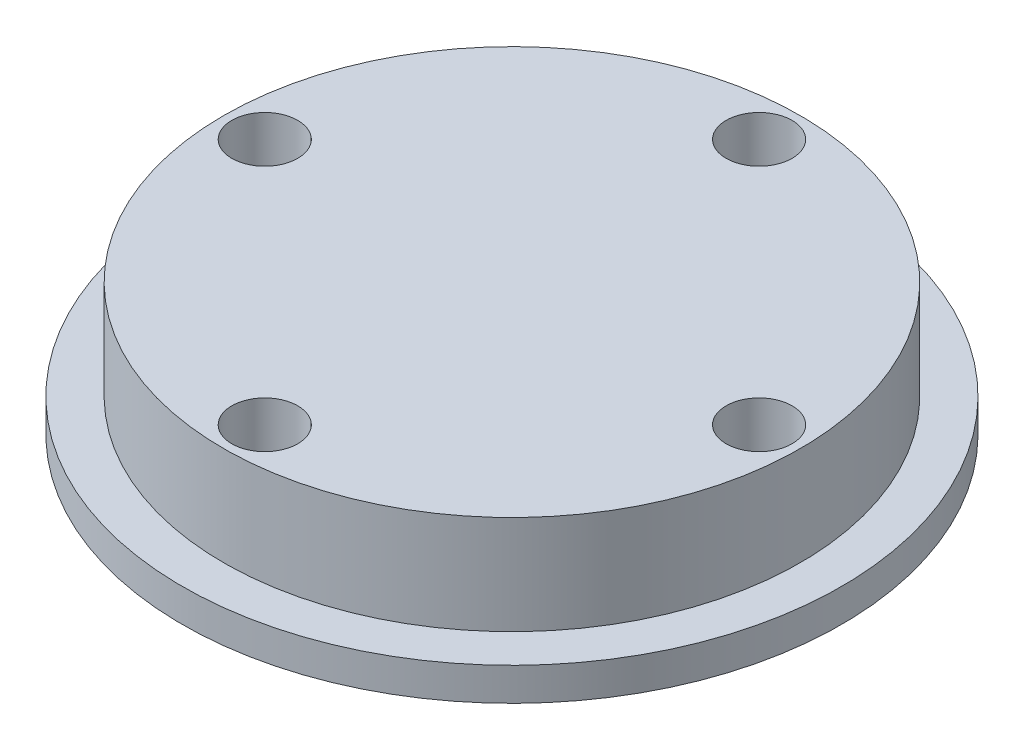
ISO-10303-21;
HEADER;
FILE_DESCRIPTION(('STEP AP214'),'2;1');
FILE_NAME('part.step','',(''),(''),'','','');
FILE_SCHEMA(('AUTOMOTIVE_DESIGN { 1 0 10303 214 1 1 1 1 }'));
ENDSEC;
DATA;
#1=APPLICATION_CONTEXT('core data for automotive mechanical design processes');
#2=APPLICATION_PROTOCOL_DEFINITION('international standard','automotive_design',2000,#1);
#3=PRODUCT_CONTEXT('',#1,'mechanical');
#4=PRODUCT('Part','Part','',(#3));
#5=PRODUCT_RELATED_PRODUCT_CATEGORY('part','',(#4));
#6=PRODUCT_DEFINITION_FORMATION('','',#4);
#7=PRODUCT_DEFINITION_CONTEXT('part definition',#1,'design');
#8=PRODUCT_DEFINITION('design','',#6,#7);
#9=PRODUCT_DEFINITION_SHAPE('','',#8);
#10=(LENGTH_UNIT() NAMED_UNIT(*) SI_UNIT(.MILLI.,.METRE.));
#11=(NAMED_UNIT(*) PLANE_ANGLE_UNIT() SI_UNIT($,.RADIAN.));
#12=(NAMED_UNIT(*) SI_UNIT($,.STERADIAN.) SOLID_ANGLE_UNIT());
#13=UNCERTAINTY_MEASURE_WITH_UNIT(LENGTH_MEASURE(1.E-05),#10,'distance_accuracy_value','');
#14=(GEOMETRIC_REPRESENTATION_CONTEXT(3) GLOBAL_UNCERTAINTY_ASSIGNED_CONTEXT((#13)) GLOBAL_UNIT_ASSIGNED_CONTEXT((#10,
#11,#12)) REPRESENTATION_CONTEXT('',''));
#15=CARTESIAN_POINT('',(0.,0.,0.));
#16=DIRECTION('',(0.,0.,1.));
#17=DIRECTION('',(1.,0.,0.));
#18=AXIS2_PLACEMENT_3D('',#15,#16,#17);
#19=CARTESIAN_POINT('',(0.,0.,0.));
#20=DIRECTION('',(0.,-1.,0.));
#21=DIRECTION('',(1.,0.,0.));
#22=AXIS2_PLACEMENT_3D('',#19,#20,#21);
#23=PLANE('',#22);
#24=CARTESIAN_POINT('',(0.,0.,-15.));
#25=DIRECTION('',(0.,-1.,0.));
#26=DIRECTION('',(1.,0.,0.));
#27=AXIS2_PLACEMENT_3D('',#24,#25,#26);
#28=CIRCLE('',#27,2.);
#29=CARTESIAN_POINT('',(2.,0.,-15.));
#30=VERTEX_POINT('',#29);
#31=EDGE_CURVE('E50',#30,#30,#28,.F.);
#32=ORIENTED_EDGE('',*,*,#31,.T.);
#33=EDGE_LOOP('',(#32));
#34=FACE_BOUND('',#33,.T.);
#35=CARTESIAN_POINT('',(15.0000000000004,0.,-4.24488671257339E-13));
#36=DIRECTION('',(0.,-1.,0.));
#37=DIRECTION('',(1.,0.,0.));
#38=AXIS2_PLACEMENT_3D('',#35,#36,#37);
#39=CIRCLE('',#38,2.00000000000033);
#40=CARTESIAN_POINT('',(17.0000000000008,0.,-4.24488671257339E-13));
#41=VERTEX_POINT('',#40);
#42=EDGE_CURVE('E72',#41,#41,#39,.F.);
#43=ORIENTED_EDGE('',*,*,#42,.T.);
#44=EDGE_LOOP('',(#43));
#45=FACE_BOUND('',#44,.T.);
#46=CARTESIAN_POINT('',(8.48977342514678E-13,0.,15.));
#47=DIRECTION('',(0.,-1.,0.));
#48=DIRECTION('',(1.,0.,0.));
#49=AXIS2_PLACEMENT_3D('',#46,#47,#48);
#50=CIRCLE('',#49,2.00000000000091);
#51=CARTESIAN_POINT('',(2.00000000000176,0.,15.));
#52=VERTEX_POINT('',#51);
#53=EDGE_CURVE('E69',#52,#52,#50,.F.);
#54=ORIENTED_EDGE('',*,*,#53,.T.);
#55=EDGE_LOOP('',(#54));
#56=FACE_BOUND('',#55,.T.);
#57=CARTESIAN_POINT('',(-14.9999999999996,0.,4.2632564145606E-13));
#58=DIRECTION('',(0.,-1.,0.));
#59=DIRECTION('',(1.,0.,0.));
#60=AXIS2_PLACEMENT_3D('',#57,#58,#59);
#61=CIRCLE('',#60,2.00000000000068);
#62=CARTESIAN_POINT('',(-12.9999999999989,0.,4.2632564145606E-13));
#63=VERTEX_POINT('',#62);
#64=EDGE_CURVE('E66',#63,#63,#61,.F.);
#65=ORIENTED_EDGE('',*,*,#64,.T.);
#66=EDGE_LOOP('',(#65));
#67=FACE_BOUND('',#66,.T.);
#68=CARTESIAN_POINT('',(0.,0.,0.));
#69=DIRECTION('',(0.,1.,0.));
#70=DIRECTION('',(-1.,0.,0.));
#71=AXIS2_PLACEMENT_3D('',#68,#69,#70);
#72=CIRCLE('',#71,20.);
#73=CARTESIAN_POINT('',(-20.,0.,0.));
#74=VERTEX_POINT('',#73);
#75=EDGE_CURVE('E10',#74,#74,#72,.T.);
#76=ORIENTED_EDGE('',*,*,#75,.F.);
#77=EDGE_LOOP('',(#76));
#78=FACE_BOUND('',#77,.T.);
#79=ADVANCED_FACE('F30',(#34,#45,#56,#67,#78),#23,.T.);
#80=CARTESIAN_POINT('',(0.,8.,0.));
#81=DIRECTION('',(0.,1.,0.));
#82=DIRECTION('',(-1.,0.,0.));
#83=AXIS2_PLACEMENT_3D('',#80,#81,#82);
#84=CYLINDRICAL_SURFACE('',#83,20.);
#85=ORIENTED_EDGE('',*,*,#75,.T.);
#86=EDGE_LOOP('',(#85));
#87=FACE_BOUND('',#86,.T.);
#88=CARTESIAN_POINT('',(0.,1.99999999999999,0.));
#89=DIRECTION('',(0.,1.,0.));
#90=DIRECTION('',(-1.,0.,0.));
#91=AXIS2_PLACEMENT_3D('',#88,#89,#90);
#92=CIRCLE('',#91,20.);
#93=CARTESIAN_POINT('',(-20.,2.,0.));
#94=VERTEX_POINT('',#93);
#95=EDGE_CURVE('E37',#94,#94,#92,.T.);
#96=ORIENTED_EDGE('',*,*,#95,.F.);
#97=EDGE_LOOP('',(#96));
#98=FACE_BOUND('',#97,.T.);
#99=ADVANCED_FACE('F92',(#87,#98),#84,.T.);
#100=CARTESIAN_POINT('',(-20.,2.,0.));
#101=DIRECTION('',(0.,1.,0.));
#102=DIRECTION('',(-1.,0.,0.));
#103=AXIS2_PLACEMENT_3D('',#100,#101,#102);
#104=PLANE('',#103);
#105=ORIENTED_EDGE('',*,*,#95,.T.);
#106=EDGE_LOOP('',(#105));
#107=FACE_BOUND('',#106,.T.);
#108=CARTESIAN_POINT('',(0.,1.99999999999999,0.));
#109=DIRECTION('',(0.,1.,0.));
#110=DIRECTION('',(-1.,0.,0.));
#111=AXIS2_PLACEMENT_3D('',#108,#109,#110);
#112=CIRCLE('',#111,17.5);
#113=CARTESIAN_POINT('',(-17.5,2.,0.));
#114=VERTEX_POINT('',#113);
#115=EDGE_CURVE('E42',#114,#114,#112,.T.);
#116=ORIENTED_EDGE('',*,*,#115,.F.);
#117=EDGE_LOOP('',(#116));
#118=FACE_BOUND('',#117,.T.);
#119=ADVANCED_FACE('F96',(#107,#118),#104,.T.);
#120=CARTESIAN_POINT('',(0.,8.,0.));
#121=DIRECTION('',(0.,1.,0.));
#122=DIRECTION('',(-1.,0.,0.));
#123=AXIS2_PLACEMENT_3D('',#120,#121,#122);
#124=CYLINDRICAL_SURFACE('',#123,17.5);
#125=ORIENTED_EDGE('',*,*,#115,.T.);
#126=EDGE_LOOP('',(#125));
#127=FACE_BOUND('',#126,.T.);
#128=CARTESIAN_POINT('',(0.,7.99999999999999,0.));
#129=DIRECTION('',(0.,1.,0.));
#130=DIRECTION('',(-1.,0.,0.));
#131=AXIS2_PLACEMENT_3D('',#128,#129,#130);
#132=CIRCLE('',#131,17.5);
#133=CARTESIAN_POINT('',(-17.5,8.,0.));
#134=VERTEX_POINT('',#133);
#135=EDGE_CURVE('E57',#134,#134,#132,.T.);
#136=ORIENTED_EDGE('',*,*,#135,.F.);
#137=EDGE_LOOP('',(#136));
#138=FACE_BOUND('',#137,.T.);
#139=ADVANCED_FACE('F100',(#127,#138),#124,.T.);
#140=CARTESIAN_POINT('',(-17.5,8.,0.));
#141=DIRECTION('',(0.,1.,0.));
#142=DIRECTION('',(-1.,0.,0.));
#143=AXIS2_PLACEMENT_3D('',#140,#141,#142);
#144=PLANE('',#143);
#145=CARTESIAN_POINT('',(0.,7.99999999999999,-15.));
#146=DIRECTION('',(0.,1.,0.));
#147=DIRECTION('',(-1.,0.,0.));
#148=AXIS2_PLACEMENT_3D('',#145,#146,#147);
#149=CIRCLE('',#148,2.);
#150=CARTESIAN_POINT('',(2.,7.99999999999999,-15.));
#151=VERTEX_POINT('',#150);
#152=EDGE_CURVE('E33',#151,#151,#149,.F.);
#153=ORIENTED_EDGE('',*,*,#152,.T.);
#154=EDGE_LOOP('',(#153));
#155=FACE_BOUND('',#154,.T.);
#156=CARTESIAN_POINT('',(15.0000000000004,7.99999999999999,-4.24488671257339E-13));
#157=DIRECTION('',(0.,1.,0.));
#158=DIRECTION('',(-1.,0.,0.));
#159=AXIS2_PLACEMENT_3D('',#156,#157,#158);
#160=CIRCLE('',#159,2.00000000000033);
#161=CARTESIAN_POINT('',(17.0000000000008,7.99999999999999,-4.24488671257339E-13));
#162=VERTEX_POINT('',#161);
#163=EDGE_CURVE('E52',#162,#162,#160,.F.);
#164=ORIENTED_EDGE('',*,*,#163,.T.);
#165=EDGE_LOOP('',(#164));
#166=FACE_BOUND('',#165,.T.);
#167=CARTESIAN_POINT('',(8.51333124420579E-13,7.99999999999999,15.));
#168=DIRECTION('',(0.,1.,0.));
#169=DIRECTION('',(-1.,0.,0.));
#170=AXIS2_PLACEMENT_3D('',#167,#168,#169);
#171=CIRCLE('',#170,2.00000000000091);
#172=CARTESIAN_POINT('',(2.00000000000176,7.99999999999999,15.));
#173=VERTEX_POINT('',#172);
#174=EDGE_CURVE('E49',#173,#173,#171,.F.);
#175=ORIENTED_EDGE('',*,*,#174,.T.);
#176=EDGE_LOOP('',(#175));
#177=FACE_BOUND('',#176,.T.);
#178=CARTESIAN_POINT('',(-14.9999999999996,8.,4.2632564145606E-13));
#179=DIRECTION('',(0.,1.,0.));
#180=DIRECTION('',(-1.,0.,0.));
#181=AXIS2_PLACEMENT_3D('',#178,#179,#180);
#182=CIRCLE('',#181,2.00000000000068);
#183=CARTESIAN_POINT('',(-12.9999999999989,8.,4.2632564145606E-13));
#184=VERTEX_POINT('',#183);
#185=EDGE_CURVE('E46',#184,#184,#182,.F.);
#186=ORIENTED_EDGE('',*,*,#185,.T.);
#187=EDGE_LOOP('',(#186));
#188=FACE_BOUND('',#187,.T.);
#189=ORIENTED_EDGE('',*,*,#135,.T.);
#190=EDGE_LOOP('',(#189));
#191=FACE_BOUND('',#190,.T.);
#192=ADVANCED_FACE('F107',(#155,#166,#177,#188,#191),#144,.T.);
#193=CARTESIAN_POINT('',(-14.9999999999996,8.000012,4.2632564145606E-13));
#194=DIRECTION('',(0.,-1.,0.));
#195=DIRECTION('',(1.,0.,0.));
#196=AXIS2_PLACEMENT_3D('',#193,#194,#195);
#197=CYLINDRICAL_SURFACE('',#196,2.00000000000068);
#198=CARTESIAN_POINT('',(-12.9999999999989,8.,4.2632564145606E-13));
#199=CARTESIAN_POINT('',(-12.9999999999989,7.91666666666667,4.2632564145606E-13));
#200=CARTESIAN_POINT('',(-12.9999999999989,7.83333333333333,4.2632564145606E-13));
#201=CARTESIAN_POINT('',(-12.9999999999989,7.66666666666667,4.2632564145606E-13));
#202=CARTESIAN_POINT('',(-12.9999999999989,7.58333333333333,4.2632564145606E-13));
#203=CARTESIAN_POINT('',(-12.9999999999989,7.41666666666667,4.2632564145606E-13));
#204=CARTESIAN_POINT('',(-12.9999999999989,7.33333333333333,4.2632564145606E-13));
#205=CARTESIAN_POINT('',(-12.9999999999989,7.16666666666667,4.2632564145606E-13));
#206=CARTESIAN_POINT('',(-12.9999999999989,7.08333333333333,4.2632564145606E-13));
#207=CARTESIAN_POINT('',(-12.9999999999989,6.91666666666667,4.2632564145606E-13));
#208=CARTESIAN_POINT('',(-12.9999999999989,6.83333333333333,4.2632564145606E-13));
#209=CARTESIAN_POINT('',(-12.9999999999989,6.66666666666667,4.2632564145606E-13));
#210=CARTESIAN_POINT('',(-12.9999999999989,6.58333333333333,4.2632564145606E-13));
#211=CARTESIAN_POINT('',(-12.9999999999989,6.41666666666667,4.2632564145606E-13));
#212=CARTESIAN_POINT('',(-12.9999999999989,6.33333333333333,4.2632564145606E-13));
#213=CARTESIAN_POINT('',(-12.9999999999989,6.16666666666667,4.2632564145606E-13));
#214=CARTESIAN_POINT('',(-12.9999999999989,6.08333333333333,4.2632564145606E-13));
#215=CARTESIAN_POINT('',(-12.9999999999989,5.91666666666667,4.2632564145606E-13));
#216=CARTESIAN_POINT('',(-12.9999999999989,5.83333333333333,4.2632564145606E-13));
#217=CARTESIAN_POINT('',(-12.9999999999989,5.66666666666667,4.2632564145606E-13));
#218=CARTESIAN_POINT('',(-12.9999999999989,5.58333333333333,4.2632564145606E-13));
#219=CARTESIAN_POINT('',(-12.9999999999989,5.41666666666667,4.2632564145606E-13));
#220=CARTESIAN_POINT('',(-12.9999999999989,5.33333333333333,4.2632564145606E-13));
#221=CARTESIAN_POINT('',(-12.9999999999989,5.16666666666667,4.2632564145606E-13));
#222=CARTESIAN_POINT('',(-12.9999999999989,5.08333333333333,4.2632564145606E-13));
#223=CARTESIAN_POINT('',(-12.9999999999989,4.91666666666667,4.2632564145606E-13));
#224=CARTESIAN_POINT('',(-12.9999999999989,4.83333333333333,4.2632564145606E-13));
#225=CARTESIAN_POINT('',(-12.9999999999989,4.66666666666667,4.2632564145606E-13));
#226=CARTESIAN_POINT('',(-12.9999999999989,4.58333333333333,4.2632564145606E-13));
#227=CARTESIAN_POINT('',(-12.9999999999989,4.41666666666667,4.2632564145606E-13));
#228=CARTESIAN_POINT('',(-12.9999999999989,4.33333333333333,4.2632564145606E-13));
#229=CARTESIAN_POINT('',(-12.9999999999989,4.16666666666667,4.2632564145606E-13));
#230=CARTESIAN_POINT('',(-12.9999999999989,4.08333333333333,4.2632564145606E-13));
#231=CARTESIAN_POINT('',(-12.9999999999989,3.91666666666667,4.2632564145606E-13));
#232=CARTESIAN_POINT('',(-12.9999999999989,3.83333333333333,4.2632564145606E-13));
#233=CARTESIAN_POINT('',(-12.9999999999989,3.66666666666667,4.2632564145606E-13));
#234=CARTESIAN_POINT('',(-12.9999999999989,3.58333333333333,4.2632564145606E-13));
#235=CARTESIAN_POINT('',(-12.9999999999989,3.41666666666667,4.2632564145606E-13));
#236=CARTESIAN_POINT('',(-12.9999999999989,3.33333333333333,4.2632564145606E-13));
#237=CARTESIAN_POINT('',(-12.9999999999989,3.16666666666667,4.2632564145606E-13));
#238=CARTESIAN_POINT('',(-12.9999999999989,3.08333333333333,4.2632564145606E-13));
#239=CARTESIAN_POINT('',(-12.9999999999989,2.91666666666667,4.2632564145606E-13));
#240=CARTESIAN_POINT('',(-12.9999999999989,2.83333333333333,4.2632564145606E-13));
#241=CARTESIAN_POINT('',(-12.9999999999989,2.66666666666667,4.2632564145606E-13));
#242=CARTESIAN_POINT('',(-12.9999999999989,2.58333333333333,4.2632564145606E-13));
#243=CARTESIAN_POINT('',(-12.9999999999989,2.41666666666667,4.2632564145606E-13));
#244=CARTESIAN_POINT('',(-12.9999999999989,2.33333333333333,4.2632564145606E-13));
#245=CARTESIAN_POINT('',(-12.9999999999989,2.16666666666667,4.2632564145606E-13));
#246=CARTESIAN_POINT('',(-12.9999999999989,2.08333333333334,4.2632564145606E-13));
#247=CARTESIAN_POINT('',(-12.9999999999989,1.91666666666667,4.2632564145606E-13));
#248=CARTESIAN_POINT('',(-12.9999999999989,1.83333333333334,4.2632564145606E-13));
#249=CARTESIAN_POINT('',(-12.9999999999989,1.66666666666667,4.2632564145606E-13));
#250=CARTESIAN_POINT('',(-12.9999999999989,1.58333333333333,4.2632564145606E-13));
#251=CARTESIAN_POINT('',(-12.9999999999989,1.41666666666667,4.2632564145606E-13));
#252=CARTESIAN_POINT('',(-12.9999999999989,1.33333333333333,4.2632564145606E-13));
#253=CARTESIAN_POINT('',(-12.9999999999989,1.16666666666667,4.2632564145606E-13));
#254=CARTESIAN_POINT('',(-12.9999999999989,1.08333333333333,4.2632564145606E-13));
#255=CARTESIAN_POINT('',(-12.9999999999989,0.916666666666668,4.2632564145606E-13));
#256=CARTESIAN_POINT('',(-12.9999999999989,0.833333333333335,4.2632564145606E-13));
#257=CARTESIAN_POINT('',(-12.9999999999989,0.666666666666668,4.2632564145606E-13));
#258=CARTESIAN_POINT('',(-12.9999999999989,0.583333333333335,4.2632564145606E-13));
#259=CARTESIAN_POINT('',(-12.9999999999989,0.416666666666668,4.2632564145606E-13));
#260=CARTESIAN_POINT('',(-12.9999999999989,0.333333333333335,4.2632564145606E-13));
#261=CARTESIAN_POINT('',(-12.9999999999989,0.166666666666669,4.2632564145606E-13));
#262=CARTESIAN_POINT('',(-12.9999999999989,0.0833333333333351,4.2632564145606E-13));
#263=CARTESIAN_POINT('',(-12.9999999999989,0.,4.2632564145606E-13));
#264=B_SPLINE_CURVE_WITH_KNOTS('',3,(#198,#199,#200,#201,#202,#203,#204,#205,#206,#207,#208,
#209,#210,#211,#212,#213,#214,#215,#216,#217,#218,#219,#220,#221,#222,#223,#224,#225,#226,#227,
#228,#229,#230,#231,#232,#233,#234,#235,#236,#237,#238,#239,#240,#241,#242,#243,#244,#245,#246,
#247,#248,#249,#250,#251,#252,#253,#254,#255,#256,#257,#258,#259,#260,#261,#262,#263),
.UNSPECIFIED.,.F.,.F.,(4,2,2,2,2,2,2,2,2,2,2,2,2,2,2,2,2,2,2,2,2,2,2,2,2,2,2,2,2,2,2,2,4),(0.,
0.249999999999999,0.499999999999999,0.749999999999999,0.999999999999999,1.25,1.5,1.75,2.,2.25,
2.5,2.75,3.,3.25,3.5,3.75,4.,4.25,4.5,4.75,5.,5.25,5.5,5.75,6.,6.25,6.5,6.75,7.,7.25,7.5,7.75,
8.),.UNSPECIFIED.);
#265=EDGE_CURVE('BSEAM111',#184,#63,#264,.T.);
#266=ORIENTED_EDGE('',*,*,#185,.F.);
#267=ORIENTED_EDGE('',*,*,#64,.F.);
#268=ORIENTED_EDGE('',*,*,#265,.T.);
#269=ORIENTED_EDGE('',*,*,#265,.F.);
#270=EDGE_LOOP('',(#266,#268,#267,#269));
#271=FACE_BOUND('',#270,.T.);
#272=ADVANCED_FACE('F111',(#271),#197,.F.);
#273=CARTESIAN_POINT('',(8.51333127954252E-13,8.000012,15.));
#274=DIRECTION('',(0.,-1.,0.));
#275=DIRECTION('',(1.,0.,0.));
#276=AXIS2_PLACEMENT_3D('',#273,#274,#275);
#277=CYLINDRICAL_SURFACE('',#276,2.00000000000091);
#278=CARTESIAN_POINT('',(2.00000000000176,7.99999999999999,15.));
#279=CARTESIAN_POINT('',(2.00000000000176,7.91666666666666,15.));
#280=CARTESIAN_POINT('',(2.00000000000176,7.83333333333333,15.));
#281=CARTESIAN_POINT('',(2.00000000000176,7.66666666666666,15.));
#282=CARTESIAN_POINT('',(2.00000000000176,7.58333333333333,15.));
#283=CARTESIAN_POINT('',(2.00000000000176,7.41666666666666,15.));
#284=CARTESIAN_POINT('',(2.00000000000176,7.33333333333333,15.));
#285=CARTESIAN_POINT('',(2.00000000000176,7.16666666666666,15.));
#286=CARTESIAN_POINT('',(2.00000000000176,7.08333333333333,15.));
#287=CARTESIAN_POINT('',(2.00000000000176,6.91666666666666,15.));
#288=CARTESIAN_POINT('',(2.00000000000176,6.83333333333333,15.));
#289=CARTESIAN_POINT('',(2.00000000000176,6.66666666666666,15.));
#290=CARTESIAN_POINT('',(2.00000000000176,6.58333333333333,15.));
#291=CARTESIAN_POINT('',(2.00000000000176,6.41666666666666,15.));
#292=CARTESIAN_POINT('',(2.00000000000176,6.33333333333333,15.));
#293=CARTESIAN_POINT('',(2.00000000000176,6.16666666666666,15.));
#294=CARTESIAN_POINT('',(2.00000000000176,6.08333333333333,15.));
#295=CARTESIAN_POINT('',(2.00000000000176,5.91666666666666,15.));
#296=CARTESIAN_POINT('',(2.00000000000176,5.83333333333333,15.));
#297=CARTESIAN_POINT('',(2.00000000000176,5.66666666666666,15.));
#298=CARTESIAN_POINT('',(2.00000000000176,5.58333333333333,15.));
#299=CARTESIAN_POINT('',(2.00000000000176,5.41666666666666,15.));
#300=CARTESIAN_POINT('',(2.00000000000176,5.33333333333333,15.));
#301=CARTESIAN_POINT('',(2.00000000000176,5.16666666666666,15.));
#302=CARTESIAN_POINT('',(2.00000000000176,5.08333333333333,15.));
#303=CARTESIAN_POINT('',(2.00000000000176,4.91666666666666,15.));
#304=CARTESIAN_POINT('',(2.00000000000176,4.83333333333333,15.));
#305=CARTESIAN_POINT('',(2.00000000000176,4.66666666666666,15.));
#306=CARTESIAN_POINT('',(2.00000000000176,4.58333333333333,15.));
#307=CARTESIAN_POINT('',(2.00000000000176,4.41666666666666,15.));
#308=CARTESIAN_POINT('',(2.00000000000176,4.33333333333333,15.));
#309=CARTESIAN_POINT('',(2.00000000000176,4.16666666666666,15.));
#310=CARTESIAN_POINT('',(2.00000000000176,4.08333333333333,15.));
#311=CARTESIAN_POINT('',(2.00000000000176,3.91666666666666,15.));
#312=CARTESIAN_POINT('',(2.00000000000176,3.83333333333333,15.));
#313=CARTESIAN_POINT('',(2.00000000000176,3.66666666666666,15.));
#314=CARTESIAN_POINT('',(2.00000000000176,3.58333333333333,15.));
#315=CARTESIAN_POINT('',(2.00000000000176,3.41666666666666,15.));
#316=CARTESIAN_POINT('',(2.00000000000176,3.33333333333333,15.));
#317=CARTESIAN_POINT('',(2.00000000000176,3.16666666666666,15.));
#318=CARTESIAN_POINT('',(2.00000000000176,3.08333333333333,15.));
#319=CARTESIAN_POINT('',(2.00000000000176,2.91666666666666,15.));
#320=CARTESIAN_POINT('',(2.00000000000176,2.83333333333333,15.));
#321=CARTESIAN_POINT('',(2.00000000000176,2.66666666666666,15.));
#322=CARTESIAN_POINT('',(2.00000000000176,2.58333333333333,15.));
#323=CARTESIAN_POINT('',(2.00000000000176,2.41666666666666,15.));
#324=CARTESIAN_POINT('',(2.00000000000176,2.33333333333333,15.));
#325=CARTESIAN_POINT('',(2.00000000000176,2.16666666666666,15.));
#326=CARTESIAN_POINT('',(2.00000000000176,2.08333333333333,15.));
#327=CARTESIAN_POINT('',(2.00000000000176,1.91666666666666,15.));
#328=CARTESIAN_POINT('',(2.00000000000176,1.83333333333333,15.));
#329=CARTESIAN_POINT('',(2.00000000000176,1.66666666666666,15.));
#330=CARTESIAN_POINT('',(2.00000000000176,1.58333333333333,15.));
#331=CARTESIAN_POINT('',(2.00000000000176,1.41666666666666,15.));
#332=CARTESIAN_POINT('',(2.00000000000176,1.33333333333333,15.));
#333=CARTESIAN_POINT('',(2.00000000000176,1.16666666666666,15.));
#334=CARTESIAN_POINT('',(2.00000000000176,1.08333333333333,15.));
#335=CARTESIAN_POINT('',(2.00000000000176,0.916666666666661,15.));
#336=CARTESIAN_POINT('',(2.00000000000176,0.833333333333328,15.));
#337=CARTESIAN_POINT('',(2.00000000000176,0.666666666666661,15.));
#338=CARTESIAN_POINT('',(2.00000000000176,0.583333333333328,15.));
#339=CARTESIAN_POINT('',(2.00000000000176,0.416666666666662,15.));
#340=CARTESIAN_POINT('',(2.00000000000176,0.333333333333328,15.));
#341=CARTESIAN_POINT('',(2.00000000000176,0.166666666666662,15.));
#342=CARTESIAN_POINT('',(2.00000000000176,0.0833333333333293,15.));
#343=CARTESIAN_POINT('',(2.00000000000176,0.,15.));
#344=B_SPLINE_CURVE_WITH_KNOTS('',3,(#278,#279,#280,#281,#282,#283,#284,#285,#286,#287,#288,
#289,#290,#291,#292,#293,#294,#295,#296,#297,#298,#299,#300,#301,#302,#303,#304,#305,#306,#307,
#308,#309,#310,#311,#312,#313,#314,#315,#316,#317,#318,#319,#320,#321,#322,#323,#324,#325,#326,
#327,#328,#329,#330,#331,#332,#333,#334,#335,#336,#337,#338,#339,#340,#341,#342,#343),
.UNSPECIFIED.,.F.,.F.,(4,2,2,2,2,2,2,2,2,2,2,2,2,2,2,2,2,2,2,2,2,2,2,2,2,2,2,2,2,2,2,2,4),(0.,
0.250000000000001,0.5,0.750000000000001,1.,1.25,1.5,1.75,2.,2.25,2.5,2.75,3.,3.25,3.5,3.75,4.,
4.25,4.5,4.75,5.,5.25,5.5,5.75,6.,6.25,6.5,6.75,7.,7.25,7.5,7.75,8.),.UNSPECIFIED.);
#345=EDGE_CURVE('BSEAM88',#173,#52,#344,.T.);
#346=ORIENTED_EDGE('',*,*,#174,.F.);
#347=ORIENTED_EDGE('',*,*,#53,.F.);
#348=ORIENTED_EDGE('',*,*,#345,.T.);
#349=ORIENTED_EDGE('',*,*,#345,.F.);
#350=EDGE_LOOP('',(#346,#348,#347,#349));
#351=FACE_BOUND('',#350,.T.);
#352=ADVANCED_FACE('F88',(#351),#277,.F.);
#353=CARTESIAN_POINT('',(15.0000000000004,8.00001199999999,-4.24488671257339E-13));
#354=DIRECTION('',(0.,-1.,0.));
#355=DIRECTION('',(1.,0.,0.));
#356=AXIS2_PLACEMENT_3D('',#353,#354,#355);
#357=CYLINDRICAL_SURFACE('',#356,2.00000000000033);
#358=CARTESIAN_POINT('',(17.0000000000008,7.99999999999999,-4.24488671257339E-13));
#359=CARTESIAN_POINT('',(17.0000000000008,7.91666666666666,-4.24488671257339E-13));
#360=CARTESIAN_POINT('',(17.0000000000008,7.83333333333332,-4.24488671257339E-13));
#361=CARTESIAN_POINT('',(17.0000000000008,7.66666666666666,-4.24488671257339E-13));
#362=CARTESIAN_POINT('',(17.0000000000008,7.58333333333332,-4.24488671257339E-13));
#363=CARTESIAN_POINT('',(17.0000000000008,7.41666666666666,-4.24488671257339E-13));
#364=CARTESIAN_POINT('',(17.0000000000008,7.33333333333332,-4.24488671257339E-13));
#365=CARTESIAN_POINT('',(17.0000000000008,7.16666666666666,-4.24488671257339E-13));
#366=CARTESIAN_POINT('',(17.0000000000008,7.08333333333332,-4.24488671257339E-13));
#367=CARTESIAN_POINT('',(17.0000000000008,6.91666666666666,-4.24488671257339E-13));
#368=CARTESIAN_POINT('',(17.0000000000008,6.83333333333332,-4.24488671257339E-13));
#369=CARTESIAN_POINT('',(17.0000000000008,6.66666666666666,-4.24488671257339E-13));
#370=CARTESIAN_POINT('',(17.0000000000008,6.58333333333332,-4.24488671257339E-13));
#371=CARTESIAN_POINT('',(17.0000000000008,6.41666666666666,-4.24488671257339E-13));
#372=CARTESIAN_POINT('',(17.0000000000008,6.33333333333332,-4.24488671257339E-13));
#373=CARTESIAN_POINT('',(17.0000000000008,6.16666666666666,-4.24488671257339E-13));
#374=CARTESIAN_POINT('',(17.0000000000008,6.08333333333332,-4.24488671257339E-13));
#375=CARTESIAN_POINT('',(17.0000000000008,5.91666666666666,-4.24488671257339E-13));
#376=CARTESIAN_POINT('',(17.0000000000008,5.83333333333332,-4.24488671257339E-13));
#377=CARTESIAN_POINT('',(17.0000000000008,5.66666666666666,-4.24488671257339E-13));
#378=CARTESIAN_POINT('',(17.0000000000008,5.58333333333332,-4.24488671257339E-13));
#379=CARTESIAN_POINT('',(17.0000000000008,5.41666666666666,-4.24488671257339E-13));
#380=CARTESIAN_POINT('',(17.0000000000008,5.33333333333332,-4.24488671257339E-13));
#381=CARTESIAN_POINT('',(17.0000000000008,5.16666666666666,-4.24488671257339E-13));
#382=CARTESIAN_POINT('',(17.0000000000008,5.08333333333332,-4.24488671257339E-13));
#383=CARTESIAN_POINT('',(17.0000000000008,4.91666666666666,-4.24488671257339E-13));
#384=CARTESIAN_POINT('',(17.0000000000008,4.83333333333332,-4.24488671257339E-13));
#385=CARTESIAN_POINT('',(17.0000000000008,4.66666666666666,-4.24488671257339E-13));
#386=CARTESIAN_POINT('',(17.0000000000008,4.58333333333332,-4.24488671257339E-13));
#387=CARTESIAN_POINT('',(17.0000000000008,4.41666666666666,-4.24488671257339E-13));
#388=CARTESIAN_POINT('',(17.0000000000008,4.33333333333332,-4.24488671257339E-13));
#389=CARTESIAN_POINT('',(17.0000000000008,4.16666666666666,-4.24488671257339E-13));
#390=CARTESIAN_POINT('',(17.0000000000008,4.08333333333332,-4.24488671257339E-13));
#391=CARTESIAN_POINT('',(17.0000000000008,3.91666666666666,-4.24488671257339E-13));
#392=CARTESIAN_POINT('',(17.0000000000008,3.83333333333332,-4.24488671257339E-13));
#393=CARTESIAN_POINT('',(17.0000000000008,3.66666666666666,-4.24488671257339E-13));
#394=CARTESIAN_POINT('',(17.0000000000008,3.58333333333332,-4.24488671257339E-13));
#395=CARTESIAN_POINT('',(17.0000000000008,3.41666666666666,-4.24488671257339E-13));
#396=CARTESIAN_POINT('',(17.0000000000008,3.33333333333332,-4.24488671257339E-13));
#397=CARTESIAN_POINT('',(17.0000000000008,3.16666666666666,-4.24488671257339E-13));
#398=CARTESIAN_POINT('',(17.0000000000008,3.08333333333332,-4.24488671257339E-13));
#399=CARTESIAN_POINT('',(17.0000000000008,2.91666666666666,-4.24488671257339E-13));
#400=CARTESIAN_POINT('',(17.0000000000008,2.83333333333332,-4.24488671257339E-13));
#401=CARTESIAN_POINT('',(17.0000000000008,2.66666666666666,-4.24488671257339E-13));
#402=CARTESIAN_POINT('',(17.0000000000008,2.58333333333332,-4.24488671257339E-13));
#403=CARTESIAN_POINT('',(17.0000000000008,2.41666666666666,-4.24488671257339E-13));
#404=CARTESIAN_POINT('',(17.0000000000008,2.33333333333332,-4.24488671257339E-13));
#405=CARTESIAN_POINT('',(17.0000000000008,2.16666666666666,-4.24488671257339E-13));
#406=CARTESIAN_POINT('',(17.0000000000008,2.08333333333332,-4.24488671257339E-13));
#407=CARTESIAN_POINT('',(17.0000000000008,1.91666666666666,-4.24488671257339E-13));
#408=CARTESIAN_POINT('',(17.0000000000008,1.83333333333332,-4.24488671257339E-13));
#409=CARTESIAN_POINT('',(17.0000000000008,1.66666666666666,-4.24488671257339E-13));
#410=CARTESIAN_POINT('',(17.0000000000008,1.58333333333332,-4.24488671257339E-13));
#411=CARTESIAN_POINT('',(17.0000000000008,1.41666666666666,-4.24488671257339E-13));
#412=CARTESIAN_POINT('',(17.0000000000008,1.33333333333332,-4.24488671257339E-13));
#413=CARTESIAN_POINT('',(17.0000000000008,1.16666666666666,-4.24488671257339E-13));
#414=CARTESIAN_POINT('',(17.0000000000008,1.08333333333332,-4.24488671257339E-13));
#415=CARTESIAN_POINT('',(17.0000000000008,0.916666666666658,-4.24488671257339E-13));
#416=CARTESIAN_POINT('',(17.0000000000008,0.833333333333324,-4.24488671257339E-13));
#417=CARTESIAN_POINT('',(17.0000000000008,0.666666666666658,-4.24488671257339E-13));
#418=CARTESIAN_POINT('',(17.0000000000008,0.583333333333324,-4.24488671257339E-13));
#419=CARTESIAN_POINT('',(17.0000000000008,0.416666666666658,-4.24488671257339E-13));
#420=CARTESIAN_POINT('',(17.0000000000008,0.333333333333325,-4.24488671257339E-13));
#421=CARTESIAN_POINT('',(17.0000000000008,0.166666666666658,-4.24488671257339E-13));
#422=CARTESIAN_POINT('',(17.0000000000008,0.0833333333333247,-4.24488671257339E-13));
#423=CARTESIAN_POINT('',(17.0000000000008,0.,-4.24488671257339E-13));
#424=B_SPLINE_CURVE_WITH_KNOTS('',3,(#358,#359,#360,#361,#362,#363,#364,#365,#366,#367,#368,
#369,#370,#371,#372,#373,#374,#375,#376,#377,#378,#379,#380,#381,#382,#383,#384,#385,#386,#387,
#388,#389,#390,#391,#392,#393,#394,#395,#396,#397,#398,#399,#400,#401,#402,#403,#404,#405,#406,
#407,#408,#409,#410,#411,#412,#413,#414,#415,#416,#417,#418,#419,#420,#421,#422,#423),
.UNSPECIFIED.,.F.,.F.,(4,2,2,2,2,2,2,2,2,2,2,2,2,2,2,2,2,2,2,2,2,2,2,2,2,2,2,2,2,2,2,2,4),(0.,
0.249999999999999,0.499999999999999,0.749999999999999,0.999999999999999,1.25,1.5,1.75,2.,2.25,
2.5,2.75,3.,3.25,3.5,3.75,4.,4.25,4.5,4.75,5.,5.25,5.5,5.75,6.,6.25,6.5,6.75,7.,7.25,7.5,7.75,
8.),.UNSPECIFIED.);
#425=EDGE_CURVE('BSEAM82',#162,#41,#424,.T.);
#426=ORIENTED_EDGE('',*,*,#163,.F.);
#427=ORIENTED_EDGE('',*,*,#42,.F.);
#428=ORIENTED_EDGE('',*,*,#425,.T.);
#429=ORIENTED_EDGE('',*,*,#425,.F.);
#430=EDGE_LOOP('',(#426,#428,#427,#429));
#431=FACE_BOUND('',#430,.T.);
#432=ADVANCED_FACE('F82',(#431),#357,.F.);
#433=CARTESIAN_POINT('',(0.,8.000012,-15.));
#434=DIRECTION('',(0.,-1.,0.));
#435=DIRECTION('',(1.,0.,0.));
#436=AXIS2_PLACEMENT_3D('',#433,#434,#435);
#437=CYLINDRICAL_SURFACE('',#436,2.);
#438=CARTESIAN_POINT('',(2.,7.99999999999999,-15.));
#439=CARTESIAN_POINT('',(2.,7.91666666666666,-15.));
#440=CARTESIAN_POINT('',(2.,7.83333333333333,-15.));
#441=CARTESIAN_POINT('',(2.,7.66666666666666,-15.));
#442=CARTESIAN_POINT('',(2.,7.58333333333333,-15.));
#443=CARTESIAN_POINT('',(2.,7.41666666666666,-15.));
#444=CARTESIAN_POINT('',(2.,7.33333333333333,-15.));
#445=CARTESIAN_POINT('',(2.,7.16666666666666,-15.));
#446=CARTESIAN_POINT('',(2.,7.08333333333333,-15.));
#447=CARTESIAN_POINT('',(2.,6.91666666666666,-15.));
#448=CARTESIAN_POINT('',(2.,6.83333333333333,-15.));
#449=CARTESIAN_POINT('',(2.,6.66666666666666,-15.));
#450=CARTESIAN_POINT('',(2.,6.58333333333333,-15.));
#451=CARTESIAN_POINT('',(2.,6.41666666666666,-15.));
#452=CARTESIAN_POINT('',(2.,6.33333333333333,-15.));
#453=CARTESIAN_POINT('',(2.,6.16666666666666,-15.));
#454=CARTESIAN_POINT('',(2.,6.08333333333333,-15.));
#455=CARTESIAN_POINT('',(2.,5.91666666666666,-15.));
#456=CARTESIAN_POINT('',(2.,5.83333333333333,-15.));
#457=CARTESIAN_POINT('',(2.,5.66666666666666,-15.));
#458=CARTESIAN_POINT('',(2.,5.58333333333333,-15.));
#459=CARTESIAN_POINT('',(2.,5.41666666666666,-15.));
#460=CARTESIAN_POINT('',(2.,5.33333333333333,-15.));
#461=CARTESIAN_POINT('',(2.,5.16666666666666,-15.));
#462=CARTESIAN_POINT('',(2.,5.08333333333333,-15.));
#463=CARTESIAN_POINT('',(2.,4.91666666666666,-15.));
#464=CARTESIAN_POINT('',(2.,4.83333333333333,-15.));
#465=CARTESIAN_POINT('',(2.,4.66666666666666,-15.));
#466=CARTESIAN_POINT('',(2.,4.58333333333333,-15.));
#467=CARTESIAN_POINT('',(2.,4.41666666666666,-15.));
#468=CARTESIAN_POINT('',(2.,4.33333333333333,-15.));
#469=CARTESIAN_POINT('',(2.,4.16666666666666,-15.));
#470=CARTESIAN_POINT('',(2.,4.08333333333333,-15.));
#471=CARTESIAN_POINT('',(2.,3.91666666666666,-15.));
#472=CARTESIAN_POINT('',(2.,3.83333333333333,-15.));
#473=CARTESIAN_POINT('',(2.,3.66666666666666,-15.));
#474=CARTESIAN_POINT('',(2.,3.58333333333333,-15.));
#475=CARTESIAN_POINT('',(2.,3.41666666666666,-15.));
#476=CARTESIAN_POINT('',(2.,3.33333333333333,-15.));
#477=CARTESIAN_POINT('',(2.,3.16666666666666,-15.));
#478=CARTESIAN_POINT('',(2.,3.08333333333333,-15.));
#479=CARTESIAN_POINT('',(2.,2.91666666666666,-15.));
#480=CARTESIAN_POINT('',(2.,2.83333333333333,-15.));
#481=CARTESIAN_POINT('',(2.,2.66666666666666,-15.));
#482=CARTESIAN_POINT('',(2.,2.58333333333333,-15.));
#483=CARTESIAN_POINT('',(2.,2.41666666666666,-15.));
#484=CARTESIAN_POINT('',(2.,2.33333333333333,-15.));
#485=CARTESIAN_POINT('',(2.,2.16666666666666,-15.));
#486=CARTESIAN_POINT('',(2.,2.08333333333333,-15.));
#487=CARTESIAN_POINT('',(2.,1.91666666666666,-15.));
#488=CARTESIAN_POINT('',(2.,1.83333333333333,-15.));
#489=CARTESIAN_POINT('',(2.,1.66666666666666,-15.));
#490=CARTESIAN_POINT('',(2.,1.58333333333333,-15.));
#491=CARTESIAN_POINT('',(2.,1.41666666666666,-15.));
#492=CARTESIAN_POINT('',(2.,1.33333333333333,-15.));
#493=CARTESIAN_POINT('',(2.,1.16666666666666,-15.));
#494=CARTESIAN_POINT('',(2.,1.08333333333333,-15.));
#495=CARTESIAN_POINT('',(2.,0.916666666666661,-15.));
#496=CARTESIAN_POINT('',(2.,0.833333333333328,-15.));
#497=CARTESIAN_POINT('',(2.,0.666666666666661,-15.));
#498=CARTESIAN_POINT('',(2.,0.583333333333328,-15.));
#499=CARTESIAN_POINT('',(2.,0.416666666666662,-15.));
#500=CARTESIAN_POINT('',(2.,0.333333333333328,-15.));
#501=CARTESIAN_POINT('',(2.,0.166666666666662,-15.));
#502=CARTESIAN_POINT('',(2.,0.0833333333333293,-15.));
#503=CARTESIAN_POINT('',(2.,0.,-15.));
#504=B_SPLINE_CURVE_WITH_KNOTS('',3,(#438,#439,#440,#441,#442,#443,#444,#445,#446,#447,#448,
#449,#450,#451,#452,#453,#454,#455,#456,#457,#458,#459,#460,#461,#462,#463,#464,#465,#466,#467,
#468,#469,#470,#471,#472,#473,#474,#475,#476,#477,#478,#479,#480,#481,#482,#483,#484,#485,#486,
#487,#488,#489,#490,#491,#492,#493,#494,#495,#496,#497,#498,#499,#500,#501,#502,#503),
.UNSPECIFIED.,.F.,.F.,(4,2,2,2,2,2,2,2,2,2,2,2,2,2,2,2,2,2,2,2,2,2,2,2,2,2,2,2,2,2,2,2,4),(0.,
0.250000000000001,0.5,0.750000000000001,1.,1.25,1.5,1.75,2.,2.25,2.5,2.75,3.,3.25,3.5,3.75,4.,
4.25,4.5,4.75,5.,5.25,5.5,5.75,6.,6.25,6.5,6.75,7.,7.25,7.5,7.75,8.),.UNSPECIFIED.);
#505=EDGE_CURVE('BSEAM80',#151,#30,#504,.T.);
#506=ORIENTED_EDGE('',*,*,#152,.F.);
#507=ORIENTED_EDGE('',*,*,#31,.F.);
#508=ORIENTED_EDGE('',*,*,#505,.T.);
#509=ORIENTED_EDGE('',*,*,#505,.F.);
#510=EDGE_LOOP('',(#506,#508,#507,#509));
#511=FACE_BOUND('',#510,.T.);
#512=ADVANCED_FACE('F80',(#511),#437,.F.);
#513=CLOSED_SHELL('',(#79,#99,#119,#139,#192,#272,#352,#432,#512));
#514=MANIFOLD_SOLID_BREP('B2',#513);
#515=ADVANCED_BREP_SHAPE_REPRESENTATION('',(#18,#514),#14);
#516=SHAPE_DEFINITION_REPRESENTATION(#9,#515);
ENDSEC;
END-ISO-10303-21;
